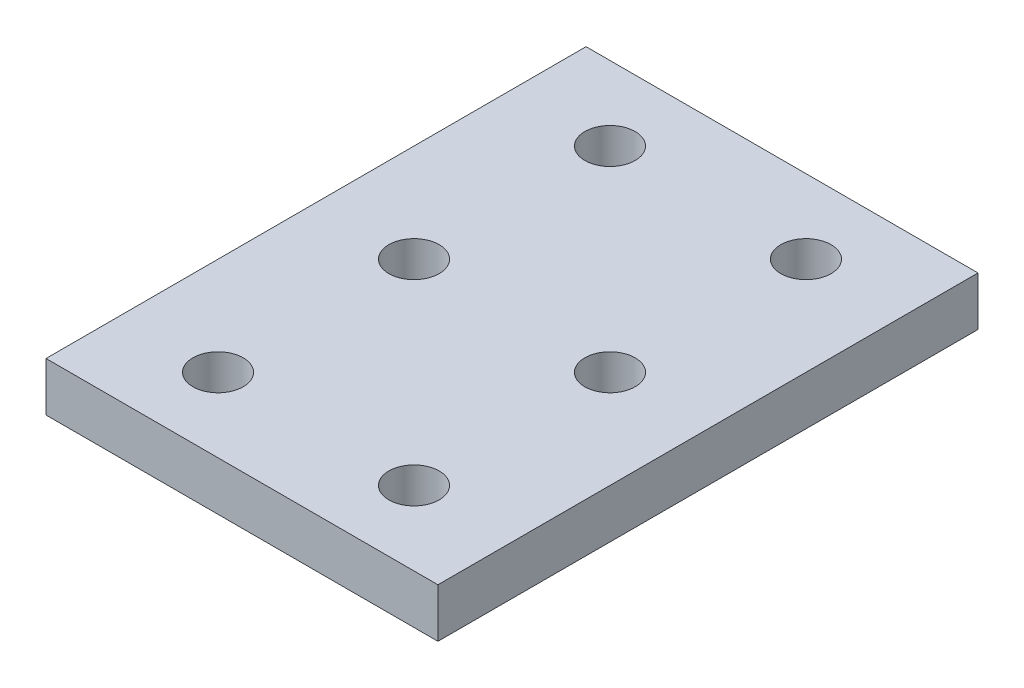
ISO-10303-21;
HEADER;
FILE_DESCRIPTION(('STEP AP214'),'2;1');
FILE_NAME('part.step','',(''),(''),'','','');
FILE_SCHEMA(('AUTOMOTIVE_DESIGN { 1 0 10303 214 1 1 1 1 }'));
ENDSEC;
DATA;
#1=APPLICATION_CONTEXT('core data for automotive mechanical design processes');
#2=APPLICATION_PROTOCOL_DEFINITION('international standard','automotive_design',2000,#1);
#3=PRODUCT_CONTEXT('',#1,'mechanical');
#4=PRODUCT('Part','Part','',(#3));
#5=PRODUCT_RELATED_PRODUCT_CATEGORY('part','',(#4));
#6=PRODUCT_DEFINITION_FORMATION('','',#4);
#7=PRODUCT_DEFINITION_CONTEXT('part definition',#1,'design');
#8=PRODUCT_DEFINITION('design','',#6,#7);
#9=PRODUCT_DEFINITION_SHAPE('','',#8);
#10=(LENGTH_UNIT() NAMED_UNIT(*) SI_UNIT(.MILLI.,.METRE.));
#11=(NAMED_UNIT(*) PLANE_ANGLE_UNIT() SI_UNIT($,.RADIAN.));
#12=(NAMED_UNIT(*) SI_UNIT($,.STERADIAN.) SOLID_ANGLE_UNIT());
#13=UNCERTAINTY_MEASURE_WITH_UNIT(LENGTH_MEASURE(1.E-05),#10,'distance_accuracy_value','');
#14=(GEOMETRIC_REPRESENTATION_CONTEXT(3) GLOBAL_UNCERTAINTY_ASSIGNED_CONTEXT((#13)) GLOBAL_UNIT_ASSIGNED_CONTEXT((#10,
#11,#12)) REPRESENTATION_CONTEXT('',''));
#15=CARTESIAN_POINT('',(0.,0.,0.));
#16=DIRECTION('',(0.,0.,1.));
#17=DIRECTION('',(1.,0.,0.));
#18=AXIS2_PLACEMENT_3D('',#15,#16,#17);
#19=CARTESIAN_POINT('',(62.5,3.175,0.));
#20=DIRECTION('',(1.,0.,0.));
#21=DIRECTION('',(0.,0.,-1.));
#22=AXIS2_PLACEMENT_3D('',#19,#20,#21);
#23=PLANE('',#22);
#24=DIRECTION('',(0.,0.,1.));
#25=VECTOR('',#24,1.);
#26=CARTESIAN_POINT('',(62.5,0.,0.));
#27=LINE('',#26,#25);
#28=CARTESIAN_POINT('',(62.5,0.,-17.5));
#29=VERTEX_POINT('',#28);
#30=CARTESIAN_POINT('',(62.5,0.,17.5));
#31=VERTEX_POINT('',#30);
#32=EDGE_CURVE('E125',#29,#31,#27,.T.);
#33=ORIENTED_EDGE('',*,*,#32,.F.);
#34=DIRECTION('',(0.,-1.,0.));
#35=VECTOR('',#34,1.);
#36=CARTESIAN_POINT('',(62.5,3.175,-17.5));
#37=LINE('',#36,#35);
#38=CARTESIAN_POINT('',(62.5,3.175,-17.5));
#39=VERTEX_POINT('',#38);
#40=EDGE_CURVE('E11',#39,#29,#37,.T.);
#41=ORIENTED_EDGE('',*,*,#40,.F.);
#42=DIRECTION('',(0.,0.,1.));
#43=VECTOR('',#42,1.);
#44=CARTESIAN_POINT('',(62.5,3.175,0.));
#45=LINE('',#44,#43);
#46=CARTESIAN_POINT('',(62.5,3.175,17.5));
#47=VERTEX_POINT('',#46);
#48=EDGE_CURVE('E100',#39,#47,#45,.T.);
#49=ORIENTED_EDGE('',*,*,#48,.T.);
#50=DIRECTION('',(0.,-1.,0.));
#51=VECTOR('',#50,1.);
#52=CARTESIAN_POINT('',(62.5,3.175,17.5));
#53=LINE('',#52,#51);
#54=EDGE_CURVE('E58',#47,#31,#53,.T.);
#55=ORIENTED_EDGE('',*,*,#54,.T.);
#56=EDGE_LOOP('',(#33,#41,#49,#55));
#57=FACE_BOUND('',#56,.T.);
#58=ADVANCED_FACE('F41',(#57),#23,.T.);
#59=CARTESIAN_POINT('',(0.,3.175,-17.5));
#60=DIRECTION('',(0.,0.,-1.));
#61=DIRECTION('',(-1.,0.,0.));
#62=AXIS2_PLACEMENT_3D('',#59,#60,#61);
#63=PLANE('',#62);
#64=DIRECTION('',(1.,0.,0.));
#65=VECTOR('',#64,1.);
#66=CARTESIAN_POINT('',(0.,0.,-17.5));
#67=LINE('',#66,#65);
#68=CARTESIAN_POINT('',(37.1,0.,-17.5));
#69=VERTEX_POINT('',#68);
#70=EDGE_CURVE('E90',#69,#29,#67,.T.);
#71=ORIENTED_EDGE('',*,*,#70,.F.);
#72=DIRECTION('',(0.,-1.,0.));
#73=VECTOR('',#72,1.);
#74=CARTESIAN_POINT('',(37.1,3.175,-17.5));
#75=LINE('',#74,#73);
#76=CARTESIAN_POINT('',(37.1,3.175,-17.5));
#77=VERTEX_POINT('',#76);
#78=EDGE_CURVE('E50',#77,#69,#75,.T.);
#79=ORIENTED_EDGE('',*,*,#78,.F.);
#80=DIRECTION('',(1.,0.,0.));
#81=VECTOR('',#80,1.);
#82=CARTESIAN_POINT('',(0.,3.175,-17.5));
#83=LINE('',#82,#81);
#84=EDGE_CURVE('E88',#77,#39,#83,.T.);
#85=ORIENTED_EDGE('',*,*,#84,.T.);
#86=ORIENTED_EDGE('',*,*,#40,.T.);
#87=EDGE_LOOP('',(#71,#79,#85,#86));
#88=FACE_BOUND('',#87,.T.);
#89=ADVANCED_FACE('F86',(#88),#63,.T.);
#90=CARTESIAN_POINT('',(37.1,3.175,0.));
#91=DIRECTION('',(1.,0.,0.));
#92=DIRECTION('',(0.,0.,-1.));
#93=AXIS2_PLACEMENT_3D('',#90,#91,#92);
#94=PLANE('',#93);
#95=DIRECTION('',(0.,0.,1.));
#96=VECTOR('',#95,1.);
#97=CARTESIAN_POINT('',(37.1,0.,0.));
#98=LINE('',#97,#96);
#99=CARTESIAN_POINT('',(37.1,0.,17.5));
#100=VERTEX_POINT('',#99);
#101=EDGE_CURVE('E128',#69,#100,#98,.T.);
#102=ORIENTED_EDGE('',*,*,#101,.T.);
#103=DIRECTION('',(0.,-1.,0.));
#104=VECTOR('',#103,1.);
#105=CARTESIAN_POINT('',(37.1,3.175,17.5));
#106=LINE('',#105,#104);
#107=CARTESIAN_POINT('',(37.1,3.175,17.5));
#108=VERTEX_POINT('',#107);
#109=EDGE_CURVE('E72',#108,#100,#106,.T.);
#110=ORIENTED_EDGE('',*,*,#109,.F.);
#111=DIRECTION('',(0.,0.,1.));
#112=VECTOR('',#111,1.);
#113=CARTESIAN_POINT('',(37.1,3.175,0.));
#114=LINE('',#113,#112);
#115=EDGE_CURVE('E93',#77,#108,#114,.T.);
#116=ORIENTED_EDGE('',*,*,#115,.F.);
#117=ORIENTED_EDGE('',*,*,#78,.T.);
#118=EDGE_LOOP('',(#102,#110,#116,#117));
#119=FACE_BOUND('',#118,.T.);
#120=ADVANCED_FACE('F94',(#119),#94,.F.);
#121=CARTESIAN_POINT('',(43.45,3.175,0.));
#122=DIRECTION('',(0.,-1.,0.));
#123=DIRECTION('',(0.,0.,-1.));
#124=AXIS2_PLACEMENT_3D('',#121,#122,#123);
#125=CYLINDRICAL_SURFACE('',#124,1.62999999999999);
#126=CARTESIAN_POINT('',(43.45,3.175,0.));
#127=DIRECTION('',(0.,1.,0.));
#128=DIRECTION('',(0.,0.,1.));
#129=AXIS2_PLACEMENT_3D('',#126,#127,#128);
#130=CIRCLE('',#129,1.62999999999999);
#131=CARTESIAN_POINT('',(43.45,3.175,1.62999999999999));
#132=VERTEX_POINT('',#131);
#133=EDGE_CURVE('E102',#132,#132,#130,.T.);
#134=ORIENTED_EDGE('',*,*,#133,.T.);
#135=EDGE_LOOP('',(#134));
#136=FACE_BOUND('',#135,.T.);
#137=CARTESIAN_POINT('',(43.45,0.,0.));
#138=DIRECTION('',(0.,1.,0.));
#139=DIRECTION('',(0.,0.,1.));
#140=AXIS2_PLACEMENT_3D('',#137,#138,#139);
#141=CIRCLE('',#140,1.62999999999999);
#142=CARTESIAN_POINT('',(43.45,0.,1.62999999999999));
#143=VERTEX_POINT('',#142);
#144=EDGE_CURVE('E122',#143,#143,#141,.T.);
#145=ORIENTED_EDGE('',*,*,#144,.F.);
#146=EDGE_LOOP('',(#145));
#147=FACE_BOUND('',#146,.T.);
#148=ADVANCED_FACE('F155',(#136,#147),#125,.F.);
#149=CARTESIAN_POINT('',(56.15,3.175,0.));
#150=DIRECTION('',(0.,-1.,0.));
#151=DIRECTION('',(0.,0.,-1.));
#152=AXIS2_PLACEMENT_3D('',#149,#150,#151);
#153=CYLINDRICAL_SURFACE('',#152,1.63000000000001);
#154=CARTESIAN_POINT('',(56.15,3.175,0.));
#155=DIRECTION('',(0.,1.,0.));
#156=DIRECTION('',(0.,0.,1.));
#157=AXIS2_PLACEMENT_3D('',#154,#155,#156);
#158=CIRCLE('',#157,1.63000000000001);
#159=CARTESIAN_POINT('',(56.15,3.175,1.63000000000001));
#160=VERTEX_POINT('',#159);
#161=EDGE_CURVE('E150',#160,#160,#158,.T.);
#162=ORIENTED_EDGE('',*,*,#161,.T.);
#163=EDGE_LOOP('',(#162));
#164=FACE_BOUND('',#163,.T.);
#165=CARTESIAN_POINT('',(56.15,0.,0.));
#166=DIRECTION('',(0.,1.,0.));
#167=DIRECTION('',(0.,0.,1.));
#168=AXIS2_PLACEMENT_3D('',#165,#166,#167);
#169=CIRCLE('',#168,1.63000000000001);
#170=CARTESIAN_POINT('',(56.15,0.,1.63000000000001));
#171=VERTEX_POINT('',#170);
#172=EDGE_CURVE('E119',#171,#171,#169,.T.);
#173=ORIENTED_EDGE('',*,*,#172,.F.);
#174=EDGE_LOOP('',(#173));
#175=FACE_BOUND('',#174,.T.);
#176=ADVANCED_FACE('F181',(#164,#175),#153,.F.);
#177=CARTESIAN_POINT('',(43.45,3.175,-12.7));
#178=DIRECTION('',(0.,-1.,0.));
#179=DIRECTION('',(0.,0.,-1.));
#180=AXIS2_PLACEMENT_3D('',#177,#178,#179);
#181=CYLINDRICAL_SURFACE('',#180,1.63);
#182=CARTESIAN_POINT('',(43.45,3.175,-12.7));
#183=DIRECTION('',(0.,1.,0.));
#184=DIRECTION('',(0.,0.,1.));
#185=AXIS2_PLACEMENT_3D('',#182,#183,#184);
#186=CIRCLE('',#185,1.63);
#187=CARTESIAN_POINT('',(43.45,3.175,-11.07));
#188=VERTEX_POINT('',#187);
#189=EDGE_CURVE('E147',#188,#188,#186,.T.);
#190=ORIENTED_EDGE('',*,*,#189,.T.);
#191=EDGE_LOOP('',(#190));
#192=FACE_BOUND('',#191,.T.);
#193=CARTESIAN_POINT('',(43.45,0.,-12.7));
#194=DIRECTION('',(0.,1.,0.));
#195=DIRECTION('',(0.,0.,1.));
#196=AXIS2_PLACEMENT_3D('',#193,#194,#195);
#197=CIRCLE('',#196,1.63);
#198=CARTESIAN_POINT('',(43.45,0.,-11.07));
#199=VERTEX_POINT('',#198);
#200=EDGE_CURVE('E116',#199,#199,#197,.T.);
#201=ORIENTED_EDGE('',*,*,#200,.F.);
#202=EDGE_LOOP('',(#201));
#203=FACE_BOUND('',#202,.T.);
#204=ADVANCED_FACE('F184',(#192,#203),#181,.F.);
#205=CARTESIAN_POINT('',(56.15,3.175,-12.7));
#206=DIRECTION('',(0.,-1.,0.));
#207=DIRECTION('',(0.,0.,-1.));
#208=AXIS2_PLACEMENT_3D('',#205,#206,#207);
#209=CYLINDRICAL_SURFACE('',#208,1.63000000000001);
#210=CARTESIAN_POINT('',(56.15,3.175,-12.7));
#211=DIRECTION('',(0.,1.,0.));
#212=DIRECTION('',(0.,0.,1.));
#213=AXIS2_PLACEMENT_3D('',#210,#211,#212);
#214=CIRCLE('',#213,1.63000000000001);
#215=CARTESIAN_POINT('',(56.15,3.175,-11.07));
#216=VERTEX_POINT('',#215);
#217=EDGE_CURVE('E142',#216,#216,#214,.T.);
#218=ORIENTED_EDGE('',*,*,#217,.T.);
#219=EDGE_LOOP('',(#218));
#220=FACE_BOUND('',#219,.T.);
#221=CARTESIAN_POINT('',(56.15,0.,-12.7));
#222=DIRECTION('',(0.,1.,0.));
#223=DIRECTION('',(0.,0.,1.));
#224=AXIS2_PLACEMENT_3D('',#221,#222,#223);
#225=CIRCLE('',#224,1.63000000000001);
#226=CARTESIAN_POINT('',(56.15,0.,-11.07));
#227=VERTEX_POINT('',#226);
#228=EDGE_CURVE('E113',#227,#227,#225,.T.);
#229=ORIENTED_EDGE('',*,*,#228,.F.);
#230=EDGE_LOOP('',(#229));
#231=FACE_BOUND('',#230,.T.);
#232=ADVANCED_FACE('F188',(#220,#231),#209,.F.);
#233=CARTESIAN_POINT('',(43.4500000000001,3.175,12.7));
#234=DIRECTION('',(0.,-1.,0.));
#235=DIRECTION('',(0.,0.,-1.));
#236=AXIS2_PLACEMENT_3D('',#233,#234,#235);
#237=CYLINDRICAL_SURFACE('',#236,1.63);
#238=CARTESIAN_POINT('',(43.4500000000001,3.175,12.7));
#239=DIRECTION('',(0.,1.,0.));
#240=DIRECTION('',(0.,0.,1.));
#241=AXIS2_PLACEMENT_3D('',#238,#239,#240);
#242=CIRCLE('',#241,1.63);
#243=CARTESIAN_POINT('',(43.4500000000001,3.175,14.33));
#244=VERTEX_POINT('',#243);
#245=EDGE_CURVE('E137',#244,#244,#242,.T.);
#246=ORIENTED_EDGE('',*,*,#245,.T.);
#247=EDGE_LOOP('',(#246));
#248=FACE_BOUND('',#247,.T.);
#249=CARTESIAN_POINT('',(43.4500000000001,0.,12.7));
#250=DIRECTION('',(0.,1.,0.));
#251=DIRECTION('',(0.,0.,1.));
#252=AXIS2_PLACEMENT_3D('',#249,#250,#251);
#253=CIRCLE('',#252,1.63);
#254=CARTESIAN_POINT('',(43.4500000000001,0.,14.33));
#255=VERTEX_POINT('',#254);
#256=EDGE_CURVE('E110',#255,#255,#253,.T.);
#257=ORIENTED_EDGE('',*,*,#256,.F.);
#258=EDGE_LOOP('',(#257));
#259=FACE_BOUND('',#258,.T.);
#260=ADVANCED_FACE('F191',(#248,#259),#237,.F.);
#261=CARTESIAN_POINT('',(56.1500000000002,3.175,12.7));
#262=DIRECTION('',(0.,-1.,0.));
#263=DIRECTION('',(0.,0.,-1.));
#264=AXIS2_PLACEMENT_3D('',#261,#262,#263);
#265=CYLINDRICAL_SURFACE('',#264,1.63000000000001);
#266=CARTESIAN_POINT('',(56.1500000000002,3.175,12.7));
#267=DIRECTION('',(0.,1.,0.));
#268=DIRECTION('',(0.,0.,1.));
#269=AXIS2_PLACEMENT_3D('',#266,#267,#268);
#270=CIRCLE('',#269,1.63000000000001);
#271=CARTESIAN_POINT('',(56.1500000000002,3.175,14.33));
#272=VERTEX_POINT('',#271);
#273=EDGE_CURVE('E133',#272,#272,#270,.T.);
#274=ORIENTED_EDGE('',*,*,#273,.T.);
#275=EDGE_LOOP('',(#274));
#276=FACE_BOUND('',#275,.T.);
#277=CARTESIAN_POINT('',(56.1500000000002,0.,12.7));
#278=DIRECTION('',(0.,1.,0.));
#279=DIRECTION('',(0.,0.,1.));
#280=AXIS2_PLACEMENT_3D('',#277,#278,#279);
#281=CIRCLE('',#280,1.63000000000001);
#282=CARTESIAN_POINT('',(56.1500000000002,0.,14.33));
#283=VERTEX_POINT('',#282);
#284=EDGE_CURVE('E107',#283,#283,#281,.T.);
#285=ORIENTED_EDGE('',*,*,#284,.F.);
#286=EDGE_LOOP('',(#285));
#287=FACE_BOUND('',#286,.T.);
#288=ADVANCED_FACE('F43',(#276,#287),#265,.F.);
#289=CARTESIAN_POINT('',(0.,3.175,17.5));
#290=DIRECTION('',(0.,0.,1.));
#291=DIRECTION('',(1.,0.,0.));
#292=AXIS2_PLACEMENT_3D('',#289,#290,#291);
#293=PLANE('',#292);
#294=DIRECTION('',(-1.,0.,0.));
#295=VECTOR('',#294,1.);
#296=CARTESIAN_POINT('',(0.,0.,17.5));
#297=LINE('',#296,#295);
#298=EDGE_CURVE('E130',#31,#100,#297,.T.);
#299=ORIENTED_EDGE('',*,*,#298,.F.);
#300=ORIENTED_EDGE('',*,*,#54,.F.);
#301=DIRECTION('',(-1.,0.,0.));
#302=VECTOR('',#301,1.);
#303=CARTESIAN_POINT('',(0.,3.175,17.5));
#304=LINE('',#303,#302);
#305=EDGE_CURVE('E97',#47,#108,#304,.T.);
#306=ORIENTED_EDGE('',*,*,#305,.T.);
#307=ORIENTED_EDGE('',*,*,#109,.T.);
#308=EDGE_LOOP('',(#299,#300,#306,#307));
#309=FACE_BOUND('',#308,.T.);
#310=ADVANCED_FACE('F160',(#309),#293,.T.);
#311=CARTESIAN_POINT('',(0.,3.175,0.));
#312=DIRECTION('',(0.,1.,0.));
#313=DIRECTION('',(0.,0.,1.));
#314=AXIS2_PLACEMENT_3D('',#311,#312,#313);
#315=PLANE('',#314);
#316=ORIENTED_EDGE('',*,*,#273,.F.);
#317=EDGE_LOOP('',(#316));
#318=FACE_BOUND('',#317,.T.);
#319=ORIENTED_EDGE('',*,*,#245,.F.);
#320=EDGE_LOOP('',(#319));
#321=FACE_BOUND('',#320,.T.);
#322=ORIENTED_EDGE('',*,*,#217,.F.);
#323=EDGE_LOOP('',(#322));
#324=FACE_BOUND('',#323,.T.);
#325=ORIENTED_EDGE('',*,*,#189,.F.);
#326=EDGE_LOOP('',(#325));
#327=FACE_BOUND('',#326,.T.);
#328=ORIENTED_EDGE('',*,*,#161,.F.);
#329=EDGE_LOOP('',(#328));
#330=FACE_BOUND('',#329,.T.);
#331=ORIENTED_EDGE('',*,*,#133,.F.);
#332=EDGE_LOOP('',(#331));
#333=FACE_BOUND('',#332,.T.);
#334=ORIENTED_EDGE('',*,*,#48,.F.);
#335=ORIENTED_EDGE('',*,*,#84,.F.);
#336=ORIENTED_EDGE('',*,*,#115,.T.);
#337=ORIENTED_EDGE('',*,*,#305,.F.);
#338=EDGE_LOOP('',(#334,#335,#336,#337));
#339=FACE_BOUND('',#338,.T.);
#340=ADVANCED_FACE('F99',(#318,#321,#324,#327,#330,#333,#339),#315,.T.);
#341=CARTESIAN_POINT('',(0.,0.,0.));
#342=DIRECTION('',(0.,1.,0.));
#343=DIRECTION('',(0.,0.,1.));
#344=AXIS2_PLACEMENT_3D('',#341,#342,#343);
#345=PLANE('',#344);
#346=ORIENTED_EDGE('',*,*,#284,.T.);
#347=EDGE_LOOP('',(#346));
#348=FACE_BOUND('',#347,.T.);
#349=ORIENTED_EDGE('',*,*,#256,.T.);
#350=EDGE_LOOP('',(#349));
#351=FACE_BOUND('',#350,.T.);
#352=ORIENTED_EDGE('',*,*,#228,.T.);
#353=EDGE_LOOP('',(#352));
#354=FACE_BOUND('',#353,.T.);
#355=ORIENTED_EDGE('',*,*,#200,.T.);
#356=EDGE_LOOP('',(#355));
#357=FACE_BOUND('',#356,.T.);
#358=ORIENTED_EDGE('',*,*,#172,.T.);
#359=EDGE_LOOP('',(#358));
#360=FACE_BOUND('',#359,.T.);
#361=ORIENTED_EDGE('',*,*,#144,.T.);
#362=EDGE_LOOP('',(#361));
#363=FACE_BOUND('',#362,.T.);
#364=ORIENTED_EDGE('',*,*,#32,.T.);
#365=ORIENTED_EDGE('',*,*,#298,.T.);
#366=ORIENTED_EDGE('',*,*,#101,.F.);
#367=ORIENTED_EDGE('',*,*,#70,.T.);
#368=EDGE_LOOP('',(#364,#365,#366,#367));
#369=FACE_BOUND('',#368,.T.);
#370=ADVANCED_FACE('F159',(#348,#351,#354,#357,#360,#363,#369),#345,.F.);
#371=CLOSED_SHELL('',(#58,#89,#120,#148,#176,#204,#232,#260,#288,#310,#340,#370));
#372=MANIFOLD_SOLID_BREP('B2',#371);
#373=ADVANCED_BREP_SHAPE_REPRESENTATION('',(#18,#372),#14);
#374=SHAPE_DEFINITION_REPRESENTATION(#9,#373);
ENDSEC;
END-ISO-10303-21;
